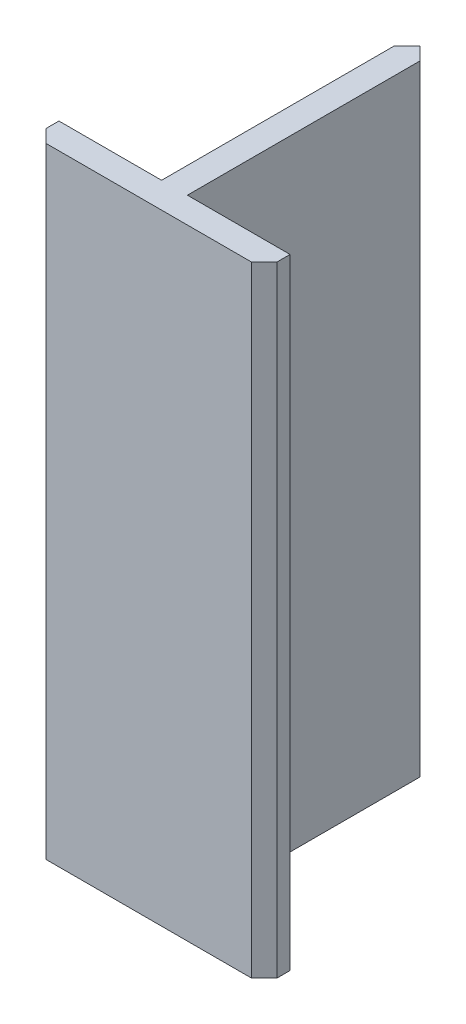
ISO-10303-21;
HEADER;
FILE_DESCRIPTION(('STEP AP214'),'2;1');
FILE_NAME('part.step','',(''),(''),'','','');
FILE_SCHEMA(('AUTOMOTIVE_DESIGN { 1 0 10303 214 1 1 1 1 }'));
ENDSEC;
DATA;
#1=APPLICATION_CONTEXT('core data for automotive mechanical design processes');
#2=APPLICATION_PROTOCOL_DEFINITION('international standard','automotive_design',2000,#1);
#3=PRODUCT_CONTEXT('',#1,'mechanical');
#4=PRODUCT('Part','Part','',(#3));
#5=PRODUCT_RELATED_PRODUCT_CATEGORY('part','',(#4));
#6=PRODUCT_DEFINITION_FORMATION('','',#4);
#7=PRODUCT_DEFINITION_CONTEXT('part definition',#1,'design');
#8=PRODUCT_DEFINITION('design','',#6,#7);
#9=PRODUCT_DEFINITION_SHAPE('','',#8);
#10=(LENGTH_UNIT() NAMED_UNIT(*) SI_UNIT(.MILLI.,.METRE.));
#11=(NAMED_UNIT(*) PLANE_ANGLE_UNIT() SI_UNIT($,.RADIAN.));
#12=(NAMED_UNIT(*) SI_UNIT($,.STERADIAN.) SOLID_ANGLE_UNIT());
#13=UNCERTAINTY_MEASURE_WITH_UNIT(LENGTH_MEASURE(1.E-05),#10,'distance_accuracy_value','');
#14=(GEOMETRIC_REPRESENTATION_CONTEXT(3) GLOBAL_UNCERTAINTY_ASSIGNED_CONTEXT((#13)) GLOBAL_UNIT_ASSIGNED_CONTEXT((#10,
#11,#12)) REPRESENTATION_CONTEXT('',''));
#15=CARTESIAN_POINT('',(0.,0.,0.));
#16=DIRECTION('',(0.,0.,1.));
#17=DIRECTION('',(1.,0.,0.));
#18=AXIS2_PLACEMENT_3D('',#15,#16,#17);
#19=CARTESIAN_POINT('',(1.27,30.48,0.));
#20=DIRECTION('',(-1.,0.,0.));
#21=DIRECTION('',(0.,0.,1.));
#22=AXIS2_PLACEMENT_3D('',#19,#20,#21);
#23=PLANE('',#22);
#24=DIRECTION('',(0.,0.,-1.));
#25=VECTOR('',#24,1.);
#26=CARTESIAN_POINT('',(1.27,-30.48,0.));
#27=LINE('',#26,#25);
#28=CARTESIAN_POINT('',(1.27,-30.48,-1.27));
#29=VERTEX_POINT('',#28);
#30=CARTESIAN_POINT('',(1.27,-30.48,-24.13));
#31=VERTEX_POINT('',#30);
#32=EDGE_CURVE('E190',#29,#31,#27,.T.);
#33=ORIENTED_EDGE('',*,*,#32,.T.);
#34=DIRECTION('',(0.,1.,0.));
#35=VECTOR('',#34,1.);
#36=CARTESIAN_POINT('',(1.27,30.48,-24.13));
#37=LINE('',#36,#35);
#38=CARTESIAN_POINT('',(1.27,30.48,-24.13));
#39=VERTEX_POINT('',#38);
#40=EDGE_CURVE('E211',#31,#39,#37,.T.);
#41=ORIENTED_EDGE('',*,*,#40,.T.);
#42=DIRECTION('',(0.,0.,-1.));
#43=VECTOR('',#42,1.);
#44=CARTESIAN_POINT('',(1.27,30.48,0.));
#45=LINE('',#44,#43);
#46=CARTESIAN_POINT('',(1.27,30.48,-1.27));
#47=VERTEX_POINT('',#46);
#48=EDGE_CURVE('E191',#47,#39,#45,.T.);
#49=ORIENTED_EDGE('',*,*,#48,.F.);
#50=DIRECTION('',(0.,-1.,0.));
#51=VECTOR('',#50,1.);
#52=CARTESIAN_POINT('',(1.27,30.48,-1.27));
#53=LINE('',#52,#51);
#54=EDGE_CURVE('E158',#47,#29,#53,.T.);
#55=ORIENTED_EDGE('',*,*,#54,.T.);
#56=EDGE_LOOP('',(#33,#41,#49,#55));
#57=FACE_BOUND('',#56,.T.);
#58=ADVANCED_FACE('F64',(#57),#23,.F.);
#59=CARTESIAN_POINT('',(-1.27,30.48,0.));
#60=DIRECTION('',(-1.,0.,0.));
#61=DIRECTION('',(0.,0.,1.));
#62=AXIS2_PLACEMENT_3D('',#59,#60,#61);
#63=PLANE('',#62);
#64=DIRECTION('',(0.,0.,-1.));
#65=VECTOR('',#64,1.);
#66=CARTESIAN_POINT('',(-1.27,30.48,0.));
#67=LINE('',#66,#65);
#68=CARTESIAN_POINT('',(-1.27,30.48,-1.27));
#69=VERTEX_POINT('',#68);
#70=CARTESIAN_POINT('',(-1.27,30.48,-24.13));
#71=VERTEX_POINT('',#70);
#72=EDGE_CURVE('E193',#69,#71,#67,.T.);
#73=ORIENTED_EDGE('',*,*,#72,.T.);
#74=DIRECTION('',(0.,-1.,0.));
#75=VECTOR('',#74,1.);
#76=CARTESIAN_POINT('',(-1.27,30.48,-24.13));
#77=LINE('',#76,#75);
#78=CARTESIAN_POINT('',(-1.27,-30.48,-24.13));
#79=VERTEX_POINT('',#78);
#80=EDGE_CURVE('E221',#71,#79,#77,.T.);
#81=ORIENTED_EDGE('',*,*,#80,.T.);
#82=DIRECTION('',(0.,0.,-1.));
#83=VECTOR('',#82,1.);
#84=CARTESIAN_POINT('',(-1.27,-30.48,0.));
#85=LINE('',#84,#83);
#86=CARTESIAN_POINT('',(-1.27,-30.48,-1.27));
#87=VERTEX_POINT('',#86);
#88=EDGE_CURVE('E194',#87,#79,#85,.T.);
#89=ORIENTED_EDGE('',*,*,#88,.F.);
#90=DIRECTION('',(0.,-1.,0.));
#91=VECTOR('',#90,1.);
#92=CARTESIAN_POINT('',(-1.27,30.48,-1.27));
#93=LINE('',#92,#91);
#94=EDGE_CURVE('E197',#69,#87,#93,.T.);
#95=ORIENTED_EDGE('',*,*,#94,.F.);
#96=EDGE_LOOP('',(#73,#81,#89,#95));
#97=FACE_BOUND('',#96,.T.);
#98=ADVANCED_FACE('F250',(#97),#63,.T.);
#99=CARTESIAN_POINT('',(0.,30.48,0.));
#100=DIRECTION('',(0.,-1.,0.));
#101=DIRECTION('',(-1.,0.,0.));
#102=AXIS2_PLACEMENT_3D('',#99,#100,#101);
#103=PLANE('',#102);
#104=ORIENTED_EDGE('',*,*,#48,.T.);
#105=DIRECTION('',(-0.707106781186546,0.,-0.70710678118655));
#106=VECTOR('',#105,1.);
#107=CARTESIAN_POINT('',(0.,30.48,-25.4));
#108=LINE('',#107,#106);
#109=CARTESIAN_POINT('',(0.,30.48,-25.4));
#110=VERTEX_POINT('',#109);
#111=EDGE_CURVE('E219',#39,#110,#108,.T.);
#112=ORIENTED_EDGE('',*,*,#111,.T.);
#113=DIRECTION('',(0.707106781186549,0.,-0.707106781186546));
#114=VECTOR('',#113,1.);
#115=CARTESIAN_POINT('',(-1.27,30.48,-24.13));
#116=LINE('',#115,#114);
#117=EDGE_CURVE('E217',#110,#71,#116,.F.);
#118=ORIENTED_EDGE('',*,*,#117,.T.);
#119=ORIENTED_EDGE('',*,*,#72,.F.);
#120=DIRECTION('',(1.,0.,0.));
#121=VECTOR('',#120,1.);
#122=CARTESIAN_POINT('',(-11.3592253256989,30.48,-1.27));
#123=LINE('',#122,#121);
#124=CARTESIAN_POINT('',(-11.3592253256989,30.48,-1.27));
#125=VERTEX_POINT('',#124);
#126=EDGE_CURVE('E161',#125,#69,#123,.T.);
#127=ORIENTED_EDGE('',*,*,#126,.F.);
#128=DIRECTION('',(0.,0.,-1.));
#129=VECTOR('',#128,1.);
#130=CARTESIAN_POINT('',(-11.3592253256989,30.48,1.27));
#131=LINE('',#130,#129);
#132=CARTESIAN_POINT('',(-11.3592253256989,30.48,0.));
#133=VERTEX_POINT('',#132);
#134=EDGE_CURVE('E177',#133,#125,#131,.T.);
#135=ORIENTED_EDGE('',*,*,#134,.F.);
#136=DIRECTION('',(0.707106781186546,0.,0.707106781186549));
#137=VECTOR('',#136,1.);
#138=CARTESIAN_POINT('',(-10.0892253256989,30.48,1.27));
#139=LINE('',#138,#137);
#140=CARTESIAN_POINT('',(-10.0892253256989,30.48,1.27));
#141=VERTEX_POINT('',#140);
#142=EDGE_CURVE('E215',#133,#141,#139,.T.);
#143=ORIENTED_EDGE('',*,*,#142,.T.);
#144=DIRECTION('',(1.,0.,0.));
#145=VECTOR('',#144,1.);
#146=CARTESIAN_POINT('',(-11.3592253256989,30.48,1.27));
#147=LINE('',#146,#145);
#148=CARTESIAN_POINT('',(10.0892253256989,30.48,1.27));
#149=VERTEX_POINT('',#148);
#150=EDGE_CURVE('E172',#141,#149,#147,.T.);
#151=ORIENTED_EDGE('',*,*,#150,.T.);
#152=DIRECTION('',(0.707106781186551,0.,-0.707106781186545));
#153=VECTOR('',#152,1.);
#154=CARTESIAN_POINT('',(11.3592253256989,30.48,0.));
#155=LINE('',#154,#153);
#156=CARTESIAN_POINT('',(11.3592253256989,30.48,0.));
#157=VERTEX_POINT('',#156);
#158=EDGE_CURVE('E81',#149,#157,#155,.T.);
#159=ORIENTED_EDGE('',*,*,#158,.T.);
#160=DIRECTION('',(0.,0.,1.));
#161=VECTOR('',#160,1.);
#162=CARTESIAN_POINT('',(11.3592253256989,30.48,-1.27));
#163=LINE('',#162,#161);
#164=CARTESIAN_POINT('',(11.3592253256989,30.48,-1.27));
#165=VERTEX_POINT('',#164);
#166=EDGE_CURVE('E162',#165,#157,#163,.T.);
#167=ORIENTED_EDGE('',*,*,#166,.F.);
#168=EDGE_CURVE('E152',#47,#165,#123,.T.);
#169=ORIENTED_EDGE('',*,*,#168,.F.);
#170=EDGE_LOOP('',(#104,#112,#118,#119,#127,#135,#143,#151,#159,#167,#169));
#171=FACE_BOUND('',#170,.T.);
#172=ADVANCED_FACE('F171',(#171),#103,.F.);
#173=CARTESIAN_POINT('',(0.,-30.48,0.));
#174=DIRECTION('',(0.,-1.,0.));
#175=DIRECTION('',(-1.,0.,0.));
#176=AXIS2_PLACEMENT_3D('',#173,#174,#175);
#177=PLANE('',#176);
#178=DIRECTION('',(-0.707106781186549,0.,0.707106781186546));
#179=VECTOR('',#178,1.);
#180=CARTESIAN_POINT('',(-12.7,-30.48,-12.7000000000001));
#181=LINE('',#180,#179);
#182=CARTESIAN_POINT('',(0.,-30.48,-25.4));
#183=VERTEX_POINT('',#182);
#184=EDGE_CURVE('E207',#79,#183,#181,.F.);
#185=ORIENTED_EDGE('',*,*,#184,.T.);
#186=DIRECTION('',(0.707106781186546,0.,0.70710678118655));
#187=VECTOR('',#186,1.);
#188=CARTESIAN_POINT('',(12.7,-30.48,-12.6999999999999));
#189=LINE('',#188,#187);
#190=EDGE_CURVE('E209',#183,#31,#189,.T.);
#191=ORIENTED_EDGE('',*,*,#190,.T.);
#192=ORIENTED_EDGE('',*,*,#32,.F.);
#193=DIRECTION('',(1.,0.,0.));
#194=VECTOR('',#193,1.);
#195=CARTESIAN_POINT('',(-11.3592253256989,-30.48,-1.27));
#196=LINE('',#195,#194);
#197=CARTESIAN_POINT('',(11.3592253256989,-30.48,-1.27));
#198=VERTEX_POINT('',#197);
#199=EDGE_CURVE('E182',#29,#198,#196,.T.);
#200=ORIENTED_EDGE('',*,*,#199,.T.);
#201=DIRECTION('',(0.,0.,1.));
#202=VECTOR('',#201,1.);
#203=CARTESIAN_POINT('',(11.3592253256989,-30.48,-1.27));
#204=LINE('',#203,#202);
#205=CARTESIAN_POINT('',(11.3592253256989,-30.48,0.));
#206=VERTEX_POINT('',#205);
#207=EDGE_CURVE('E168',#198,#206,#204,.T.);
#208=ORIENTED_EDGE('',*,*,#207,.T.);
#209=DIRECTION('',(-0.707106781186551,0.,0.707106781186545));
#210=VECTOR('',#209,1.);
#211=CARTESIAN_POINT('',(5.67961266284941,-30.48,5.67961266284946));
#212=LINE('',#211,#210);
#213=CARTESIAN_POINT('',(10.0892253256989,-30.48,1.27));
#214=VERTEX_POINT('',#213);
#215=EDGE_CURVE('E203',#206,#214,#212,.T.);
#216=ORIENTED_EDGE('',*,*,#215,.T.);
#217=DIRECTION('',(1.,0.,0.));
#218=VECTOR('',#217,1.);
#219=CARTESIAN_POINT('',(-11.3592253256989,-30.48,1.27));
#220=LINE('',#219,#218);
#221=CARTESIAN_POINT('',(-10.0892253256989,-30.48,1.27));
#222=VERTEX_POINT('',#221);
#223=EDGE_CURVE('E179',#222,#214,#220,.T.);
#224=ORIENTED_EDGE('',*,*,#223,.F.);
#225=DIRECTION('',(-0.707106781186546,0.,-0.707106781186549));
#226=VECTOR('',#225,1.);
#227=CARTESIAN_POINT('',(-5.67961266284949,-30.48,5.67961266284946));
#228=LINE('',#227,#226);
#229=CARTESIAN_POINT('',(-11.3592253256989,-30.48,0.));
#230=VERTEX_POINT('',#229);
#231=EDGE_CURVE('E205',#222,#230,#228,.T.);
#232=ORIENTED_EDGE('',*,*,#231,.T.);
#233=DIRECTION('',(0.,0.,-1.));
#234=VECTOR('',#233,1.);
#235=CARTESIAN_POINT('',(-11.3592253256989,-30.48,1.27));
#236=LINE('',#235,#234);
#237=CARTESIAN_POINT('',(-11.3592253256989,-30.48,-1.27));
#238=VERTEX_POINT('',#237);
#239=EDGE_CURVE('E174',#230,#238,#236,.T.);
#240=ORIENTED_EDGE('',*,*,#239,.T.);
#241=EDGE_CURVE('E183',#238,#87,#196,.T.);
#242=ORIENTED_EDGE('',*,*,#241,.T.);
#243=ORIENTED_EDGE('',*,*,#88,.T.);
#244=EDGE_LOOP('',(#185,#191,#192,#200,#208,#216,#224,#232,#240,#242,#243));
#245=FACE_BOUND('',#244,.T.);
#246=ADVANCED_FACE('F242',(#245),#177,.T.);
#247=CARTESIAN_POINT('',(-11.3592253256989,30.48,-1.27));
#248=DIRECTION('',(0.,0.,-1.));
#249=DIRECTION('',(-1.,0.,0.));
#250=AXIS2_PLACEMENT_3D('',#247,#248,#249);
#251=PLANE('',#250);
#252=ORIENTED_EDGE('',*,*,#54,.F.);
#253=ORIENTED_EDGE('',*,*,#168,.T.);
#254=DIRECTION('',(0.,-1.,0.));
#255=VECTOR('',#254,1.);
#256=CARTESIAN_POINT('',(11.3592253256989,30.48,-1.27));
#257=LINE('',#256,#255);
#258=EDGE_CURVE('E155',#165,#198,#257,.T.);
#259=ORIENTED_EDGE('',*,*,#258,.T.);
#260=ORIENTED_EDGE('',*,*,#199,.F.);
#261=EDGE_LOOP('',(#252,#253,#259,#260));
#262=FACE_BOUND('',#261,.T.);
#263=ADVANCED_FACE('F154',(#262),#251,.T.);
#264=CARTESIAN_POINT('',(-11.3592253256989,30.48,1.27));
#265=DIRECTION('',(0.,0.,-1.));
#266=DIRECTION('',(-1.,0.,0.));
#267=AXIS2_PLACEMENT_3D('',#264,#265,#266);
#268=PLANE('',#267);
#269=ORIENTED_EDGE('',*,*,#150,.F.);
#270=DIRECTION('',(0.,-1.,0.));
#271=VECTOR('',#270,1.);
#272=CARTESIAN_POINT('',(-10.0892253256989,-30.48,1.27));
#273=LINE('',#272,#271);
#274=EDGE_CURVE('E224',#141,#222,#273,.T.);
#275=ORIENTED_EDGE('',*,*,#274,.T.);
#276=ORIENTED_EDGE('',*,*,#223,.T.);
#277=DIRECTION('',(0.,1.,0.));
#278=VECTOR('',#277,1.);
#279=CARTESIAN_POINT('',(10.0892253256989,30.48,1.27));
#280=LINE('',#279,#278);
#281=EDGE_CURVE('E89',#214,#149,#280,.T.);
#282=ORIENTED_EDGE('',*,*,#281,.T.);
#283=EDGE_LOOP('',(#269,#275,#276,#282));
#284=FACE_BOUND('',#283,.T.);
#285=ADVANCED_FACE('F240',(#284),#268,.F.);
#286=CARTESIAN_POINT('',(11.3592253256989,30.48,-1.27));
#287=DIRECTION('',(1.,0.,0.));
#288=DIRECTION('',(0.,0.,-1.));
#289=AXIS2_PLACEMENT_3D('',#286,#287,#288);
#290=PLANE('',#289);
#291=ORIENTED_EDGE('',*,*,#166,.T.);
#292=DIRECTION('',(0.,-1.,0.));
#293=VECTOR('',#292,1.);
#294=CARTESIAN_POINT('',(11.3592253256989,-30.48,0.));
#295=LINE('',#294,#293);
#296=EDGE_CURVE('E12',#157,#206,#295,.T.);
#297=ORIENTED_EDGE('',*,*,#296,.T.);
#298=ORIENTED_EDGE('',*,*,#207,.F.);
#299=ORIENTED_EDGE('',*,*,#258,.F.);
#300=EDGE_LOOP('',(#291,#297,#298,#299));
#301=FACE_BOUND('',#300,.T.);
#302=ADVANCED_FACE('F165',(#301),#290,.T.);
#303=ORIENTED_EDGE('',*,*,#126,.T.);
#304=ORIENTED_EDGE('',*,*,#94,.T.);
#305=ORIENTED_EDGE('',*,*,#241,.F.);
#306=DIRECTION('',(0.,-1.,0.));
#307=VECTOR('',#306,1.);
#308=CARTESIAN_POINT('',(-11.3592253256989,30.48,-1.27));
#309=LINE('',#308,#307);
#310=EDGE_CURVE('E169',#125,#238,#309,.T.);
#311=ORIENTED_EDGE('',*,*,#310,.F.);
#312=EDGE_LOOP('',(#303,#304,#305,#311));
#313=FACE_BOUND('',#312,.T.);
#314=ADVANCED_FACE('F280',(#313),#251,.T.);
#315=CARTESIAN_POINT('',(-11.3592253256989,30.48,1.27));
#316=DIRECTION('',(-1.,0.,0.));
#317=DIRECTION('',(0.,0.,1.));
#318=AXIS2_PLACEMENT_3D('',#315,#316,#317);
#319=PLANE('',#318);
#320=ORIENTED_EDGE('',*,*,#239,.F.);
#321=DIRECTION('',(0.,1.,0.));
#322=VECTOR('',#321,1.);
#323=CARTESIAN_POINT('',(-11.3592253256989,30.48,0.));
#324=LINE('',#323,#322);
#325=EDGE_CURVE('E74',#230,#133,#324,.T.);
#326=ORIENTED_EDGE('',*,*,#325,.T.);
#327=ORIENTED_EDGE('',*,*,#134,.T.);
#328=ORIENTED_EDGE('',*,*,#310,.T.);
#329=EDGE_LOOP('',(#320,#326,#327,#328));
#330=FACE_BOUND('',#329,.T.);
#331=ADVANCED_FACE('F231',(#330),#319,.T.);
#332=CARTESIAN_POINT('',(-1.27,30.48,-24.13));
#333=DIRECTION('',(0.707106781186546,0.,0.707106781186549));
#334=DIRECTION('',(0.,-1.,0.));
#335=AXIS2_PLACEMENT_3D('',#332,#333,#334);
#336=PLANE('',#335);
#337=ORIENTED_EDGE('',*,*,#80,.F.);
#338=ORIENTED_EDGE('',*,*,#117,.F.);
#339=DIRECTION('',(0.,1.,0.));
#340=VECTOR('',#339,1.);
#341=CARTESIAN_POINT('',(0.,30.48,-25.4));
#342=LINE('',#341,#340);
#343=EDGE_CURVE('E69',#183,#110,#342,.T.);
#344=ORIENTED_EDGE('',*,*,#343,.F.);
#345=ORIENTED_EDGE('',*,*,#184,.F.);
#346=EDGE_LOOP('',(#337,#338,#344,#345));
#347=FACE_BOUND('',#346,.T.);
#348=ADVANCED_FACE('F267',(#347),#336,.F.);
#349=CARTESIAN_POINT('',(0.,30.48,-25.4));
#350=DIRECTION('',(0.70710678118655,0.,-0.707106781186546));
#351=DIRECTION('',(0.,1.,0.));
#352=AXIS2_PLACEMENT_3D('',#349,#350,#351);
#353=PLANE('',#352);
#354=ORIENTED_EDGE('',*,*,#111,.F.);
#355=ORIENTED_EDGE('',*,*,#40,.F.);
#356=ORIENTED_EDGE('',*,*,#190,.F.);
#357=ORIENTED_EDGE('',*,*,#343,.T.);
#358=EDGE_LOOP('',(#354,#355,#356,#357));
#359=FACE_BOUND('',#358,.T.);
#360=ADVANCED_FACE('F248',(#359),#353,.T.);
#361=CARTESIAN_POINT('',(-10.0892253256989,30.48,1.27));
#362=DIRECTION('',(-0.707106781186549,0.,0.707106781186546));
#363=DIRECTION('',(0.,1.,0.));
#364=AXIS2_PLACEMENT_3D('',#361,#362,#363);
#365=PLANE('',#364);
#366=ORIENTED_EDGE('',*,*,#142,.F.);
#367=ORIENTED_EDGE('',*,*,#325,.F.);
#368=ORIENTED_EDGE('',*,*,#231,.F.);
#369=ORIENTED_EDGE('',*,*,#274,.F.);
#370=EDGE_LOOP('',(#366,#367,#368,#369));
#371=FACE_BOUND('',#370,.T.);
#372=ADVANCED_FACE('F238',(#371),#365,.T.);
#373=CARTESIAN_POINT('',(11.3592253256989,30.48,0.));
#374=DIRECTION('',(0.707106781186545,0.,0.707106781186551));
#375=DIRECTION('',(0.,1.,0.));
#376=AXIS2_PLACEMENT_3D('',#373,#374,#375);
#377=PLANE('',#376);
#378=ORIENTED_EDGE('',*,*,#158,.F.);
#379=ORIENTED_EDGE('',*,*,#281,.F.);
#380=ORIENTED_EDGE('',*,*,#215,.F.);
#381=ORIENTED_EDGE('',*,*,#296,.F.);
#382=EDGE_LOOP('',(#378,#379,#380,#381));
#383=FACE_BOUND('',#382,.T.);
#384=ADVANCED_FACE('F67',(#383),#377,.T.);
#385=CLOSED_SHELL('',(#58,#98,#172,#246,#263,#285,#302,#314,#331,#348,#360,#372,#384));
#386=MANIFOLD_SOLID_BREP('B2',#385);
#387=ADVANCED_BREP_SHAPE_REPRESENTATION('',(#18,#386),#14);
#388=SHAPE_DEFINITION_REPRESENTATION(#9,#387);
ENDSEC;
END-ISO-10303-21;
